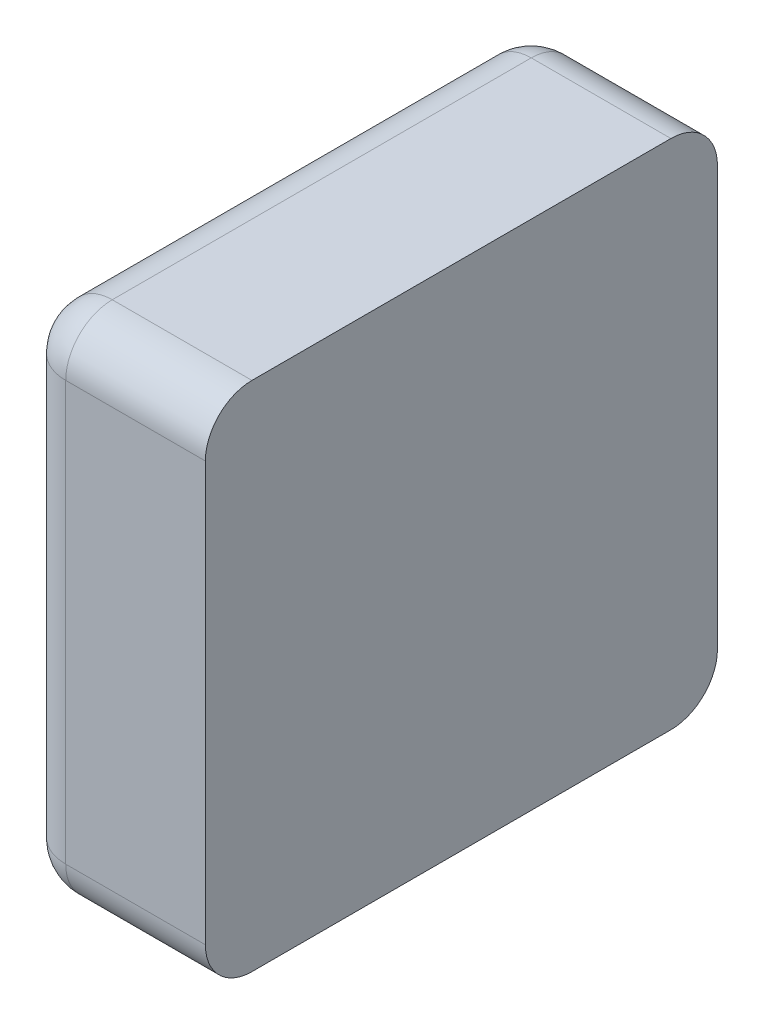
ISO-10303-21;
HEADER;
FILE_DESCRIPTION(('STEP AP214'),'2;1');
FILE_NAME('part.step','',(''),(''),'','','');
FILE_SCHEMA(('AUTOMOTIVE_DESIGN { 1 0 10303 214 1 1 1 1 }'));
ENDSEC;
DATA;
#1=APPLICATION_CONTEXT('core data for automotive mechanical design processes');
#2=APPLICATION_PROTOCOL_DEFINITION('international standard','automotive_design',2000,#1);
#3=PRODUCT_CONTEXT('',#1,'mechanical');
#4=PRODUCT('Part','Part','',(#3));
#5=PRODUCT_RELATED_PRODUCT_CATEGORY('part','',(#4));
#6=PRODUCT_DEFINITION_FORMATION('','',#4);
#7=PRODUCT_DEFINITION_CONTEXT('part definition',#1,'design');
#8=PRODUCT_DEFINITION('design','',#6,#7);
#9=PRODUCT_DEFINITION_SHAPE('','',#8);
#10=(LENGTH_UNIT() NAMED_UNIT(*) SI_UNIT(.MILLI.,.METRE.));
#11=(NAMED_UNIT(*) PLANE_ANGLE_UNIT() SI_UNIT($,.RADIAN.));
#12=(NAMED_UNIT(*) SI_UNIT($,.STERADIAN.) SOLID_ANGLE_UNIT());
#13=UNCERTAINTY_MEASURE_WITH_UNIT(LENGTH_MEASURE(1.E-05),#10,'distance_accuracy_value','');
#14=(GEOMETRIC_REPRESENTATION_CONTEXT(3) GLOBAL_UNCERTAINTY_ASSIGNED_CONTEXT((#13)) GLOBAL_UNIT_ASSIGNED_CONTEXT((#10,
#11,#12)) REPRESENTATION_CONTEXT('',''));
#15=CARTESIAN_POINT('',(0.,0.,0.));
#16=DIRECTION('',(0.,0.,1.));
#17=DIRECTION('',(1.,0.,0.));
#18=AXIS2_PLACEMENT_3D('',#15,#16,#17);
#19=CARTESIAN_POINT('',(0.,0.,0.));
#20=DIRECTION('',(1.,0.,0.));
#21=DIRECTION('',(0.,0.,-1.));
#22=AXIS2_PLACEMENT_3D('',#19,#20,#21);
#23=PLANE('',#22);
#24=DIRECTION('',(0.,0.,1.));
#25=VECTOR('',#24,1.);
#26=CARTESIAN_POINT('',(0.,0.5,0.));
#27=LINE('',#26,#25);
#28=CARTESIAN_POINT('',(0.,0.5,0.05));
#29=VERTEX_POINT('',#28);
#30=CARTESIAN_POINT('',(0.,0.5,0.5));
#31=VERTEX_POINT('',#30);
#32=EDGE_CURVE('E163',#29,#31,#27,.T.);
#33=ORIENTED_EDGE('',*,*,#32,.F.);
#34=DIRECTION('',(0.,1.,0.));
#35=VECTOR('',#34,1.);
#36=CARTESIAN_POINT('',(0.,0.,0.05));
#37=LINE('',#36,#35);
#38=CARTESIAN_POINT('',(0.,0.05,0.05));
#39=VERTEX_POINT('',#38);
#40=EDGE_CURVE('E204',#39,#29,#37,.T.);
#41=ORIENTED_EDGE('',*,*,#40,.F.);
#42=DIRECTION('',(0.,0.,1.));
#43=VECTOR('',#42,1.);
#44=CARTESIAN_POINT('',(0.,0.05,0.));
#45=LINE('',#44,#43);
#46=CARTESIAN_POINT('',(0.,0.05,0.5));
#47=VERTEX_POINT('',#46);
#48=EDGE_CURVE('E205',#47,#39,#45,.F.);
#49=ORIENTED_EDGE('',*,*,#48,.F.);
#50=DIRECTION('',(0.,1.,0.));
#51=VECTOR('',#50,1.);
#52=CARTESIAN_POINT('',(0.,0.,0.5));
#53=LINE('',#52,#51);
#54=EDGE_CURVE('E208',#31,#47,#53,.F.);
#55=ORIENTED_EDGE('',*,*,#54,.F.);
#56=EDGE_LOOP('',(#33,#41,#49,#55));
#57=FACE_BOUND('',#56,.T.);
#58=ADVANCED_FACE('F17',(#57),#23,.F.);
#59=CARTESIAN_POINT('',(0.05,0.05,0.));
#60=DIRECTION('',(0.,0.,1.));
#61=DIRECTION('',(1.,0.,0.));
#62=AXIS2_PLACEMENT_3D('',#59,#60,#61);
#63=CYLINDRICAL_SURFACE('',#62,0.05);
#64=DIRECTION('',(0.,0.,1.));
#65=VECTOR('',#64,1.);
#66=CARTESIAN_POINT('',(0.05,0.,0.));
#67=LINE('',#66,#65);
#68=CARTESIAN_POINT('',(0.05,0.,0.05));
#69=VERTEX_POINT('',#68);
#70=CARTESIAN_POINT('',(0.05,0.,0.500000000000168));
#71=VERTEX_POINT('',#70);
#72=EDGE_CURVE('E273',#69,#71,#67,.T.);
#73=ORIENTED_EDGE('',*,*,#72,.T.);
#74=CARTESIAN_POINT('',(0.05,0.05,0.5));
#75=DIRECTION('',(0.,7.66574547575187E-12,1.));
#76=DIRECTION('',(-1.,0.,0.));
#77=AXIS2_PLACEMENT_3D('',#74,#75,#76);
#78=CIRCLE('',#77,0.05);
#79=EDGE_CURVE('E211',#47,#71,#78,.T.);
#80=ORIENTED_EDGE('',*,*,#79,.F.);
#81=ORIENTED_EDGE('',*,*,#48,.T.);
#82=CARTESIAN_POINT('',(0.05,0.05,0.05));
#83=DIRECTION('',(0.,0.,1.));
#84=DIRECTION('',(-1.,0.,0.));
#85=AXIS2_PLACEMENT_3D('',#82,#83,#84);
#86=CIRCLE('',#85,0.05);
#87=EDGE_CURVE('E201',#69,#39,#86,.F.);
#88=ORIENTED_EDGE('',*,*,#87,.F.);
#89=EDGE_LOOP('',(#73,#80,#81,#88));
#90=FACE_BOUND('',#89,.T.);
#91=ADVANCED_FACE('F194',(#90),#63,.T.);
#92=CARTESIAN_POINT('',(0.05,0.05,0.05));
#93=DIRECTION('',(-1.,0.,0.));
#94=DIRECTION('',(0.,-1.,0.));
#95=AXIS2_PLACEMENT_3D('',#92,#93,#94);
#96=SPHERICAL_SURFACE('',#95,0.05);
#97=CARTESIAN_POINT('',(0.05,0.05,0.05));
#98=DIRECTION('',(1.,0.,0.));
#99=DIRECTION('',(0.,0.,-1.));
#100=AXIS2_PLACEMENT_3D('',#97,#98,#99);
#101=CIRCLE('',#100,0.05);
#102=CARTESIAN_POINT('',(0.05,0.05,0.));
#103=VERTEX_POINT('',#102);
#104=EDGE_CURVE('E73',#69,#103,#101,.T.);
#105=ORIENTED_EDGE('',*,*,#104,.F.);
#106=ORIENTED_EDGE('',*,*,#87,.T.);
#107=CARTESIAN_POINT('',(0.05,0.05,0.05));
#108=DIRECTION('',(0.,1.,0.));
#109=DIRECTION('',(0.,0.,1.));
#110=AXIS2_PLACEMENT_3D('',#107,#108,#109);
#111=CIRCLE('',#110,0.05);
#112=EDGE_CURVE('E224',#103,#39,#111,.T.);
#113=ORIENTED_EDGE('',*,*,#112,.F.);
#114=EDGE_LOOP('',(#105,#106,#113));
#115=FACE_BOUND('',#114,.T.);
#116=ADVANCED_FACE('F190',(#115),#96,.T.);
#117=CARTESIAN_POINT('',(0.05,0.,0.05));
#118=DIRECTION('',(0.,1.,0.));
#119=DIRECTION('',(0.,0.,1.));
#120=AXIS2_PLACEMENT_3D('',#117,#118,#119);
#121=CYLINDRICAL_SURFACE('',#120,0.05);
#122=DIRECTION('',(0.,1.,0.));
#123=VECTOR('',#122,1.);
#124=CARTESIAN_POINT('',(0.05,0.,0.));
#125=LINE('',#124,#123);
#126=CARTESIAN_POINT('',(0.05,0.5,0.));
#127=VERTEX_POINT('',#126);
#128=EDGE_CURVE('E77',#127,#103,#125,.F.);
#129=ORIENTED_EDGE('',*,*,#128,.T.);
#130=ORIENTED_EDGE('',*,*,#112,.T.);
#131=ORIENTED_EDGE('',*,*,#40,.T.);
#132=CARTESIAN_POINT('',(0.05,0.5,0.05));
#133=DIRECTION('',(0.,-1.,0.));
#134=DIRECTION('',(-1.,0.,0.));
#135=AXIS2_PLACEMENT_3D('',#132,#133,#134);
#136=CIRCLE('',#135,0.05);
#137=EDGE_CURVE('E173',#127,#29,#136,.F.);
#138=ORIENTED_EDGE('',*,*,#137,.F.);
#139=EDGE_LOOP('',(#129,#130,#131,#138));
#140=FACE_BOUND('',#139,.T.);
#141=ADVANCED_FACE('F186',(#140),#121,.T.);
#142=CARTESIAN_POINT('',(0.05,0.5,0.05));
#143=DIRECTION('',(-1.,0.,0.));
#144=DIRECTION('',(0.,-1.,0.));
#145=AXIS2_PLACEMENT_3D('',#142,#143,#144);
#146=SPHERICAL_SURFACE('',#145,0.05);
#147=CARTESIAN_POINT('',(0.05,0.5,0.05));
#148=DIRECTION('',(1.,0.,0.));
#149=DIRECTION('',(0.,0.,-1.));
#150=AXIS2_PLACEMENT_3D('',#147,#148,#149);
#151=CIRCLE('',#150,0.05);
#152=CARTESIAN_POINT('',(0.05,0.55,0.05));
#153=VERTEX_POINT('',#152);
#154=EDGE_CURVE('E121',#127,#153,#151,.T.);
#155=ORIENTED_EDGE('',*,*,#154,.F.);
#156=ORIENTED_EDGE('',*,*,#137,.T.);
#157=CARTESIAN_POINT('',(0.05,0.5,0.05));
#158=DIRECTION('',(0.,0.,1.));
#159=DIRECTION('',(1.,0.,0.));
#160=AXIS2_PLACEMENT_3D('',#157,#158,#159);
#161=CIRCLE('',#160,0.05);
#162=EDGE_CURVE('E170',#153,#29,#161,.T.);
#163=ORIENTED_EDGE('',*,*,#162,.F.);
#164=EDGE_LOOP('',(#155,#156,#163));
#165=FACE_BOUND('',#164,.T.);
#166=ADVANCED_FACE('F183',(#165),#146,.T.);
#167=CARTESIAN_POINT('',(0.05,0.5,0.));
#168=DIRECTION('',(0.,0.,1.));
#169=DIRECTION('',(1.,0.,0.));
#170=AXIS2_PLACEMENT_3D('',#167,#168,#169);
#171=CYLINDRICAL_SURFACE('',#170,0.05);
#172=ORIENTED_EDGE('',*,*,#162,.T.);
#173=ORIENTED_EDGE('',*,*,#32,.T.);
#174=CARTESIAN_POINT('',(0.05,0.5,0.5));
#175=DIRECTION('',(0.,0.,-1.));
#176=DIRECTION('',(-1.,0.,0.));
#177=AXIS2_PLACEMENT_3D('',#174,#175,#176);
#178=CIRCLE('',#177,0.05);
#179=CARTESIAN_POINT('',(0.05,0.55,0.5));
#180=VERTEX_POINT('',#179);
#181=EDGE_CURVE('E159',#180,#31,#178,.F.);
#182=ORIENTED_EDGE('',*,*,#181,.F.);
#183=DIRECTION('',(0.,0.,1.));
#184=VECTOR('',#183,1.);
#185=CARTESIAN_POINT('',(0.05,0.55,0.));
#186=LINE('',#185,#184);
#187=EDGE_CURVE('E115',#153,#180,#186,.T.);
#188=ORIENTED_EDGE('',*,*,#187,.F.);
#189=EDGE_LOOP('',(#172,#173,#182,#188));
#190=FACE_BOUND('',#189,.T.);
#191=ADVANCED_FACE('F151',(#190),#171,.T.);
#192=CARTESIAN_POINT('',(0.05,0.5,0.5));
#193=DIRECTION('',(-1.,0.,0.));
#194=DIRECTION('',(0.,0.,-1.));
#195=AXIS2_PLACEMENT_3D('',#192,#193,#194);
#196=SPHERICAL_SURFACE('',#195,0.05);
#197=CARTESIAN_POINT('',(0.05,0.5,0.5));
#198=DIRECTION('',(1.,0.,0.));
#199=DIRECTION('',(0.,0.,-1.));
#200=AXIS2_PLACEMENT_3D('',#197,#198,#199);
#201=CIRCLE('',#200,0.05);
#202=CARTESIAN_POINT('',(0.05,0.5,0.55));
#203=VERTEX_POINT('',#202);
#204=EDGE_CURVE('E114',#180,#203,#201,.T.);
#205=ORIENTED_EDGE('',*,*,#204,.F.);
#206=ORIENTED_EDGE('',*,*,#181,.T.);
#207=CARTESIAN_POINT('',(0.05,0.5,0.5));
#208=DIRECTION('',(0.,1.,0.));
#209=DIRECTION('',(0.,0.,1.));
#210=AXIS2_PLACEMENT_3D('',#207,#208,#209);
#211=CIRCLE('',#210,0.05);
#212=EDGE_CURVE('E162',#203,#31,#211,.F.);
#213=ORIENTED_EDGE('',*,*,#212,.F.);
#214=EDGE_LOOP('',(#205,#206,#213));
#215=FACE_BOUND('',#214,.T.);
#216=ADVANCED_FACE('F146',(#215),#196,.T.);
#217=CARTESIAN_POINT('',(0.05,0.,0.5));
#218=DIRECTION('',(0.,1.,0.));
#219=DIRECTION('',(0.,0.,1.));
#220=AXIS2_PLACEMENT_3D('',#217,#218,#219);
#221=CYLINDRICAL_SURFACE('',#220,0.05);
#222=ORIENTED_EDGE('',*,*,#212,.T.);
#223=ORIENTED_EDGE('',*,*,#54,.T.);
#224=CARTESIAN_POINT('',(0.05,0.05,0.5));
#225=DIRECTION('',(0.,1.,0.));
#226=DIRECTION('',(-1.,0.,0.));
#227=AXIS2_PLACEMENT_3D('',#224,#225,#226);
#228=CIRCLE('',#227,0.05);
#229=CARTESIAN_POINT('',(0.05,0.05,0.55));
#230=VERTEX_POINT('',#229);
#231=EDGE_CURVE('E275',#230,#47,#228,.F.);
#232=ORIENTED_EDGE('',*,*,#231,.F.);
#233=DIRECTION('',(0.,1.,0.));
#234=VECTOR('',#233,1.);
#235=CARTESIAN_POINT('',(0.05,0.,0.55));
#236=LINE('',#235,#234);
#237=EDGE_CURVE('E108',#203,#230,#236,.F.);
#238=ORIENTED_EDGE('',*,*,#237,.F.);
#239=EDGE_LOOP('',(#222,#223,#232,#238));
#240=FACE_BOUND('',#239,.T.);
#241=ADVANCED_FACE('F141',(#240),#221,.T.);
#242=CARTESIAN_POINT('',(0.05,0.05,0.5));
#243=DIRECTION('',(-1.,0.,0.));
#244=DIRECTION('',(0.,1.,0.));
#245=AXIS2_PLACEMENT_3D('',#242,#243,#244);
#246=SPHERICAL_SURFACE('',#245,0.05);
#247=CARTESIAN_POINT('',(0.05,0.05,0.5));
#248=DIRECTION('',(1.,0.,0.));
#249=DIRECTION('',(0.,0.,-1.));
#250=AXIS2_PLACEMENT_3D('',#247,#248,#249);
#251=CIRCLE('',#250,0.05);
#252=EDGE_CURVE('E91',#230,#71,#251,.T.);
#253=ORIENTED_EDGE('',*,*,#252,.F.);
#254=ORIENTED_EDGE('',*,*,#231,.T.);
#255=ORIENTED_EDGE('',*,*,#79,.T.);
#256=EDGE_LOOP('',(#253,#254,#255));
#257=FACE_BOUND('',#256,.T.);
#258=ADVANCED_FACE('F136',(#257),#246,.T.);
#259=CARTESIAN_POINT('',(0.,0.,0.));
#260=DIRECTION('',(0.,1.,0.));
#261=DIRECTION('',(0.,0.,1.));
#262=AXIS2_PLACEMENT_3D('',#259,#260,#261);
#263=PLANE('',#262);
#264=DIRECTION('',(1.,0.,0.));
#265=VECTOR('',#264,1.);
#266=CARTESIAN_POINT('',(0.,0.,0.5));
#267=LINE('',#266,#265);
#268=CARTESIAN_POINT('',(0.2,0.,0.5));
#269=VERTEX_POINT('',#268);
#270=EDGE_CURVE('E97',#71,#269,#267,.T.);
#271=ORIENTED_EDGE('',*,*,#270,.F.);
#272=ORIENTED_EDGE('',*,*,#72,.F.);
#273=DIRECTION('',(1.,0.,0.));
#274=VECTOR('',#273,1.);
#275=CARTESIAN_POINT('',(0.,0.,0.05));
#276=LINE('',#275,#274);
#277=CARTESIAN_POINT('',(0.2,0.,0.05));
#278=VERTEX_POINT('',#277);
#279=EDGE_CURVE('E60',#278,#69,#276,.F.);
#280=ORIENTED_EDGE('',*,*,#279,.F.);
#281=DIRECTION('',(0.,0.,-1.));
#282=VECTOR('',#281,1.);
#283=CARTESIAN_POINT('',(0.2,0.,0.));
#284=LINE('',#283,#282);
#285=EDGE_CURVE('E90',#269,#278,#284,.T.);
#286=ORIENTED_EDGE('',*,*,#285,.F.);
#287=EDGE_LOOP('',(#271,#272,#280,#286));
#288=FACE_BOUND('',#287,.T.);
#289=ADVANCED_FACE('F140',(#288),#263,.F.);
#290=CARTESIAN_POINT('',(0.,0.05,0.05));
#291=DIRECTION('',(1.,0.,0.));
#292=DIRECTION('',(0.,0.,-1.));
#293=AXIS2_PLACEMENT_3D('',#290,#291,#292);
#294=CYLINDRICAL_SURFACE('',#293,0.05);
#295=CARTESIAN_POINT('',(0.2,0.05,0.05));
#296=DIRECTION('',(1.,0.,0.));
#297=DIRECTION('',(0.,0.,-1.));
#298=AXIS2_PLACEMENT_3D('',#295,#296,#297);
#299=CIRCLE('',#298,0.05);
#300=CARTESIAN_POINT('',(0.2,0.05,0.));
#301=VERTEX_POINT('',#300);
#302=EDGE_CURVE('E20',#278,#301,#299,.T.);
#303=ORIENTED_EDGE('',*,*,#302,.F.);
#304=ORIENTED_EDGE('',*,*,#279,.T.);
#305=ORIENTED_EDGE('',*,*,#104,.T.);
#306=DIRECTION('',(1.,0.,0.));
#307=VECTOR('',#306,1.);
#308=CARTESIAN_POINT('',(0.,0.05,0.));
#309=LINE('',#308,#307);
#310=EDGE_CURVE('E66',#103,#301,#309,.T.);
#311=ORIENTED_EDGE('',*,*,#310,.T.);
#312=EDGE_LOOP('',(#303,#304,#305,#311));
#313=FACE_BOUND('',#312,.T.);
#314=ADVANCED_FACE('F68',(#313),#294,.T.);
#315=CARTESIAN_POINT('',(0.,0.,0.));
#316=DIRECTION('',(0.,0.,1.));
#317=DIRECTION('',(1.,0.,0.));
#318=AXIS2_PLACEMENT_3D('',#315,#316,#317);
#319=PLANE('',#318);
#320=DIRECTION('',(0.,1.,0.));
#321=VECTOR('',#320,1.);
#322=CARTESIAN_POINT('',(0.2,0.,0.));
#323=LINE('',#322,#321);
#324=CARTESIAN_POINT('',(0.2,0.5,0.));
#325=VERTEX_POINT('',#324);
#326=EDGE_CURVE('E80',#301,#325,#323,.T.);
#327=ORIENTED_EDGE('',*,*,#326,.F.);
#328=ORIENTED_EDGE('',*,*,#310,.F.);
#329=ORIENTED_EDGE('',*,*,#128,.F.);
#330=DIRECTION('',(1.,0.,0.));
#331=VECTOR('',#330,1.);
#332=CARTESIAN_POINT('',(0.,0.5,0.));
#333=LINE('',#332,#331);
#334=EDGE_CURVE('E76',#325,#127,#333,.F.);
#335=ORIENTED_EDGE('',*,*,#334,.F.);
#336=EDGE_LOOP('',(#327,#328,#329,#335));
#337=FACE_BOUND('',#336,.T.);
#338=ADVANCED_FACE('F81',(#337),#319,.F.);
#339=CARTESIAN_POINT('',(0.,0.5,0.05));
#340=DIRECTION('',(1.,0.,0.));
#341=DIRECTION('',(0.,0.,-1.));
#342=AXIS2_PLACEMENT_3D('',#339,#340,#341);
#343=CYLINDRICAL_SURFACE('',#342,0.05);
#344=ORIENTED_EDGE('',*,*,#334,.T.);
#345=ORIENTED_EDGE('',*,*,#154,.T.);
#346=DIRECTION('',(1.,0.,0.));
#347=VECTOR('',#346,1.);
#348=CARTESIAN_POINT('',(0.,0.55,0.05));
#349=LINE('',#348,#347);
#350=CARTESIAN_POINT('',(0.2,0.55,0.05));
#351=VERTEX_POINT('',#350);
#352=EDGE_CURVE('E118',#351,#153,#349,.F.);
#353=ORIENTED_EDGE('',*,*,#352,.F.);
#354=CARTESIAN_POINT('',(0.2,0.5,0.05));
#355=DIRECTION('',(1.,0.,0.));
#356=DIRECTION('',(0.,0.,-1.));
#357=AXIS2_PLACEMENT_3D('',#354,#355,#356);
#358=CIRCLE('',#357,0.05);
#359=EDGE_CURVE('E86',#325,#351,#358,.T.);
#360=ORIENTED_EDGE('',*,*,#359,.F.);
#361=EDGE_LOOP('',(#344,#345,#353,#360));
#362=FACE_BOUND('',#361,.T.);
#363=ADVANCED_FACE('F326',(#362),#343,.T.);
#364=CARTESIAN_POINT('',(0.,0.55,0.));
#365=DIRECTION('',(0.,1.,0.));
#366=DIRECTION('',(0.,0.,1.));
#367=AXIS2_PLACEMENT_3D('',#364,#365,#366);
#368=PLANE('',#367);
#369=DIRECTION('',(1.,0.,0.));
#370=VECTOR('',#369,1.);
#371=CARTESIAN_POINT('',(0.,0.55,0.5));
#372=LINE('',#371,#370);
#373=CARTESIAN_POINT('',(0.2,0.55,0.5));
#374=VERTEX_POINT('',#373);
#375=EDGE_CURVE('E111',#374,#180,#372,.F.);
#376=ORIENTED_EDGE('',*,*,#375,.F.);
#377=DIRECTION('',(0.,0.,-1.));
#378=VECTOR('',#377,1.);
#379=CARTESIAN_POINT('',(0.2,0.55,0.));
#380=LINE('',#379,#378);
#381=EDGE_CURVE('E229',#351,#374,#380,.F.);
#382=ORIENTED_EDGE('',*,*,#381,.F.);
#383=ORIENTED_EDGE('',*,*,#352,.T.);
#384=ORIENTED_EDGE('',*,*,#187,.T.);
#385=EDGE_LOOP('',(#376,#382,#383,#384));
#386=FACE_BOUND('',#385,.T.);
#387=ADVANCED_FACE('F323',(#386),#368,.T.);
#388=CARTESIAN_POINT('',(0.,0.5,0.5));
#389=DIRECTION('',(1.,0.,0.));
#390=DIRECTION('',(0.,0.,-1.));
#391=AXIS2_PLACEMENT_3D('',#388,#389,#390);
#392=CYLINDRICAL_SURFACE('',#391,0.05);
#393=DIRECTION('',(1.,0.,0.));
#394=VECTOR('',#393,1.);
#395=CARTESIAN_POINT('',(0.,0.5,0.55));
#396=LINE('',#395,#394);
#397=CARTESIAN_POINT('',(0.2,0.5,0.55));
#398=VERTEX_POINT('',#397);
#399=EDGE_CURVE('E100',#398,#203,#396,.F.);
#400=ORIENTED_EDGE('',*,*,#399,.F.);
#401=CARTESIAN_POINT('',(0.2,0.5,0.5));
#402=DIRECTION('',(1.,0.,0.));
#403=DIRECTION('',(0.,0.,-1.));
#404=AXIS2_PLACEMENT_3D('',#401,#402,#403);
#405=CIRCLE('',#404,0.05);
#406=EDGE_CURVE('E227',#374,#398,#405,.T.);
#407=ORIENTED_EDGE('',*,*,#406,.F.);
#408=ORIENTED_EDGE('',*,*,#375,.T.);
#409=ORIENTED_EDGE('',*,*,#204,.T.);
#410=EDGE_LOOP('',(#400,#407,#408,#409));
#411=FACE_BOUND('',#410,.T.);
#412=ADVANCED_FACE('F244',(#411),#392,.T.);
#413=CARTESIAN_POINT('',(0.,0.,0.55));
#414=DIRECTION('',(0.,0.,1.));
#415=DIRECTION('',(1.,0.,0.));
#416=AXIS2_PLACEMENT_3D('',#413,#414,#415);
#417=PLANE('',#416);
#418=DIRECTION('',(0.,1.,0.));
#419=VECTOR('',#418,1.);
#420=CARTESIAN_POINT('',(0.2,0.,0.55));
#421=LINE('',#420,#419);
#422=CARTESIAN_POINT('',(0.2,0.05,0.55));
#423=VERTEX_POINT('',#422);
#424=EDGE_CURVE('E26',#398,#423,#421,.F.);
#425=ORIENTED_EDGE('',*,*,#424,.F.);
#426=ORIENTED_EDGE('',*,*,#399,.T.);
#427=ORIENTED_EDGE('',*,*,#237,.T.);
#428=DIRECTION('',(1.,0.,0.));
#429=VECTOR('',#428,1.);
#430=CARTESIAN_POINT('',(0.,0.05,0.55));
#431=LINE('',#430,#429);
#432=EDGE_CURVE('E35',#423,#230,#431,.F.);
#433=ORIENTED_EDGE('',*,*,#432,.F.);
#434=EDGE_LOOP('',(#425,#426,#427,#433));
#435=FACE_BOUND('',#434,.T.);
#436=ADVANCED_FACE('F234',(#435),#417,.T.);
#437=CARTESIAN_POINT('',(0.,0.05,0.5));
#438=DIRECTION('',(1.,0.,0.));
#439=DIRECTION('',(0.,0.,-1.));
#440=AXIS2_PLACEMENT_3D('',#437,#438,#439);
#441=CYLINDRICAL_SURFACE('',#440,0.05);
#442=ORIENTED_EDGE('',*,*,#432,.T.);
#443=ORIENTED_EDGE('',*,*,#252,.T.);
#444=ORIENTED_EDGE('',*,*,#270,.T.);
#445=CARTESIAN_POINT('',(0.2,0.05,0.5));
#446=DIRECTION('',(1.,0.,0.));
#447=DIRECTION('',(0.,0.,-1.));
#448=AXIS2_PLACEMENT_3D('',#445,#446,#447);
#449=CIRCLE('',#448,0.05);
#450=EDGE_CURVE('E11',#423,#269,#449,.T.);
#451=ORIENTED_EDGE('',*,*,#450,.F.);
#452=EDGE_LOOP('',(#442,#443,#444,#451));
#453=FACE_BOUND('',#452,.T.);
#454=ADVANCED_FACE('F308',(#453),#441,.T.);
#455=CARTESIAN_POINT('',(0.2,0.,0.));
#456=DIRECTION('',(1.,0.,0.));
#457=DIRECTION('',(0.,0.,-1.));
#458=AXIS2_PLACEMENT_3D('',#455,#456,#457);
#459=PLANE('',#458);
#460=ORIENTED_EDGE('',*,*,#424,.T.);
#461=ORIENTED_EDGE('',*,*,#450,.T.);
#462=ORIENTED_EDGE('',*,*,#285,.T.);
#463=ORIENTED_EDGE('',*,*,#302,.T.);
#464=ORIENTED_EDGE('',*,*,#326,.T.);
#465=ORIENTED_EDGE('',*,*,#359,.T.);
#466=ORIENTED_EDGE('',*,*,#381,.T.);
#467=ORIENTED_EDGE('',*,*,#406,.T.);
#468=EDGE_LOOP('',(#460,#461,#462,#463,#464,#465,#466,#467));
#469=FACE_BOUND('',#468,.T.);
#470=ADVANCED_FACE('F89',(#469),#459,.T.);
#471=CLOSED_SHELL('',(#58,#91,#116,#141,#166,#191,#216,#241,#258,#289,#314,#338,#363,#387,#412,
#436,#454,#470));
#472=MANIFOLD_SOLID_BREP('B1',#471);
#473=ADVANCED_BREP_SHAPE_REPRESENTATION('',(#18,#472),#14);
#474=SHAPE_DEFINITION_REPRESENTATION(#9,#473);
ENDSEC;
END-ISO-10303-21;
